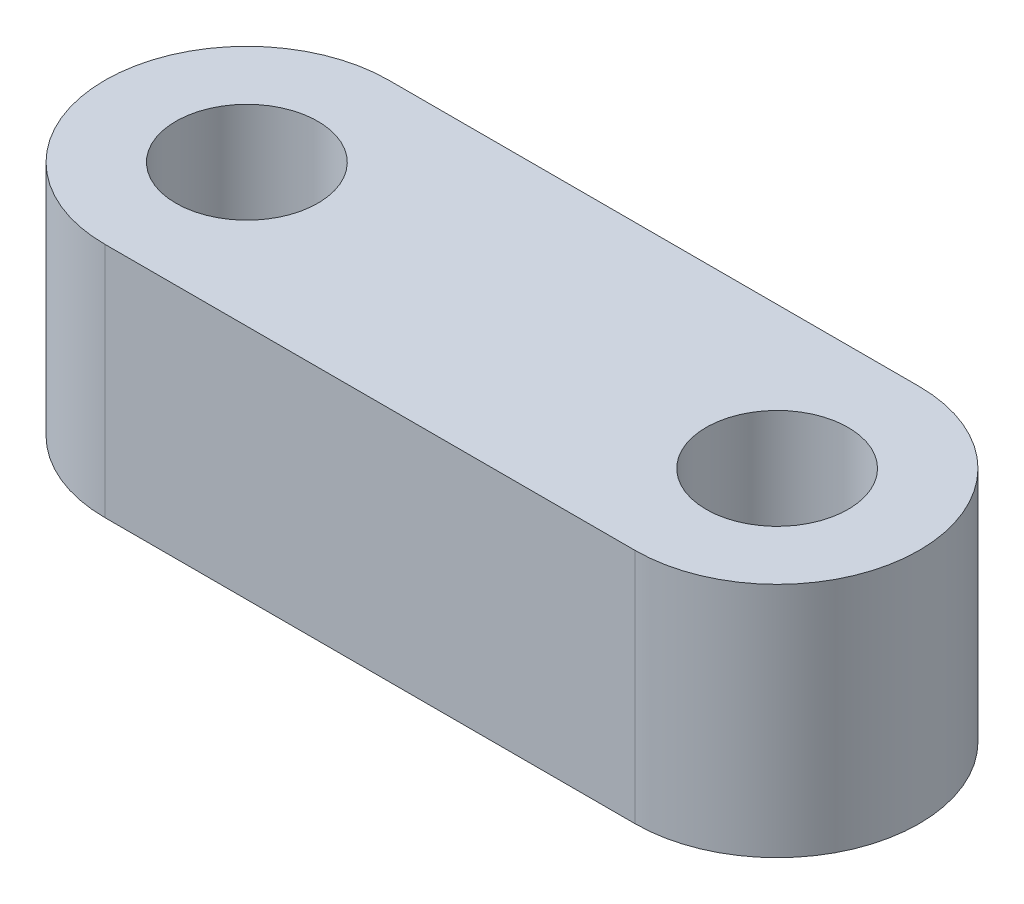
ISO-10303-21;
HEADER;
FILE_DESCRIPTION(('STEP AP214'),'2;1');
FILE_NAME('part.step','',(''),(''),'','','');
FILE_SCHEMA(('AUTOMOTIVE_DESIGN { 1 0 10303 214 1 1 1 1 }'));
ENDSEC;
DATA;
#1=APPLICATION_CONTEXT('core data for automotive mechanical design processes');
#2=APPLICATION_PROTOCOL_DEFINITION('international standard','automotive_design',2000,#1);
#3=PRODUCT_CONTEXT('',#1,'mechanical');
#4=PRODUCT('Part','Part','',(#3));
#5=PRODUCT_RELATED_PRODUCT_CATEGORY('part','',(#4));
#6=PRODUCT_DEFINITION_FORMATION('','',#4);
#7=PRODUCT_DEFINITION_CONTEXT('part definition',#1,'design');
#8=PRODUCT_DEFINITION('design','',#6,#7);
#9=PRODUCT_DEFINITION_SHAPE('','',#8);
#10=(LENGTH_UNIT() NAMED_UNIT(*) SI_UNIT(.MILLI.,.METRE.));
#11=(NAMED_UNIT(*) PLANE_ANGLE_UNIT() SI_UNIT($,.RADIAN.));
#12=(NAMED_UNIT(*) SI_UNIT($,.STERADIAN.) SOLID_ANGLE_UNIT());
#13=UNCERTAINTY_MEASURE_WITH_UNIT(LENGTH_MEASURE(1.E-05),#10,'distance_accuracy_value','');
#14=(GEOMETRIC_REPRESENTATION_CONTEXT(3) GLOBAL_UNCERTAINTY_ASSIGNED_CONTEXT((#13)) GLOBAL_UNIT_ASSIGNED_CONTEXT((#10,
#11,#12)) REPRESENTATION_CONTEXT('',''));
#15=CARTESIAN_POINT('',(0.,0.,0.));
#16=DIRECTION('',(0.,0.,1.));
#17=DIRECTION('',(1.,0.,0.));
#18=AXIS2_PLACEMENT_3D('',#15,#16,#17);
#19=CARTESIAN_POINT('',(0.,100.,0.));
#20=DIRECTION('',(0.,1.,0.));
#21=DIRECTION('',(0.,0.,1.));
#22=AXIS2_PLACEMENT_3D('',#19,#20,#21);
#23=PLANE('',#22);
#24=CARTESIAN_POINT('',(0.,100.,0.));
#25=DIRECTION('',(0.,1.,0.));
#26=DIRECTION('',(0.,0.,1.));
#27=AXIS2_PLACEMENT_3D('',#24,#25,#26);
#28=CIRCLE('',#27,30.);
#29=CARTESIAN_POINT('',(0.,100.,30.));
#30=VERTEX_POINT('',#29);
#31=EDGE_CURVE('E100',#30,#30,#28,.T.);
#32=ORIENTED_EDGE('',*,*,#31,.F.);
#33=EDGE_LOOP('',(#32));
#34=FACE_BOUND('',#33,.T.);
#35=CARTESIAN_POINT('',(0.,100.,0.));
#36=DIRECTION('',(0.,1.,0.));
#37=DIRECTION('',(0.,0.,1.));
#38=AXIS2_PLACEMENT_3D('',#35,#36,#37);
#39=CIRCLE('',#38,60.);
#40=CARTESIAN_POINT('',(0.,100.,-60.));
#41=VERTEX_POINT('',#40);
#42=CARTESIAN_POINT('',(0.,100.,60.));
#43=VERTEX_POINT('',#42);
#44=EDGE_CURVE('E85',#41,#43,#39,.T.);
#45=ORIENTED_EDGE('',*,*,#44,.T.);
#46=DIRECTION('',(1.,0.,0.));
#47=VECTOR('',#46,1.);
#48=CARTESIAN_POINT('',(0.,100.,60.));
#49=LINE('',#48,#47);
#50=CARTESIAN_POINT('',(224.,100.,60.));
#51=VERTEX_POINT('',#50);
#52=EDGE_CURVE('E80',#43,#51,#49,.T.);
#53=ORIENTED_EDGE('',*,*,#52,.T.);
#54=CARTESIAN_POINT('',(224.,100.,0.));
#55=DIRECTION('',(0.,1.,0.));
#56=DIRECTION('',(0.,0.,1.));
#57=AXIS2_PLACEMENT_3D('',#54,#55,#56);
#58=CIRCLE('',#57,60.);
#59=CARTESIAN_POINT('',(224.,100.,-60.));
#60=VERTEX_POINT('',#59);
#61=EDGE_CURVE('E83',#51,#60,#58,.T.);
#62=ORIENTED_EDGE('',*,*,#61,.T.);
#63=DIRECTION('',(-1.,0.,0.));
#64=VECTOR('',#63,1.);
#65=CARTESIAN_POINT('',(0.,100.,-60.));
#66=LINE('',#65,#64);
#67=EDGE_CURVE('E50',#60,#41,#66,.T.);
#68=ORIENTED_EDGE('',*,*,#67,.T.);
#69=EDGE_LOOP('',(#45,#53,#62,#68));
#70=FACE_BOUND('',#69,.T.);
#71=CARTESIAN_POINT('',(224.,100.,0.));
#72=DIRECTION('',(0.,1.,0.));
#73=DIRECTION('',(0.,0.,1.));
#74=AXIS2_PLACEMENT_3D('',#71,#72,#73);
#75=CIRCLE('',#74,30.);
#76=CARTESIAN_POINT('',(224.,100.,30.));
#77=VERTEX_POINT('',#76);
#78=EDGE_CURVE('E115',#77,#77,#75,.T.);
#79=ORIENTED_EDGE('',*,*,#78,.F.);
#80=EDGE_LOOP('',(#79));
#81=FACE_BOUND('',#80,.T.);
#82=ADVANCED_FACE('F33',(#34,#70,#81),#23,.T.);
#83=CARTESIAN_POINT('',(0.,0.,0.));
#84=DIRECTION('',(0.,1.,0.));
#85=DIRECTION('',(0.,0.,1.));
#86=AXIS2_PLACEMENT_3D('',#83,#84,#85);
#87=PLANE('',#86);
#88=CARTESIAN_POINT('',(0.,0.,0.));
#89=DIRECTION('',(0.,1.,0.));
#90=DIRECTION('',(0.,0.,1.));
#91=AXIS2_PLACEMENT_3D('',#88,#89,#90);
#92=CIRCLE('',#91,60.);
#93=CARTESIAN_POINT('',(0.,0.,-60.));
#94=VERTEX_POINT('',#93);
#95=CARTESIAN_POINT('',(0.,0.,60.));
#96=VERTEX_POINT('',#95);
#97=EDGE_CURVE('E97',#94,#96,#92,.T.);
#98=ORIENTED_EDGE('',*,*,#97,.F.);
#99=DIRECTION('',(-1.,0.,0.));
#100=VECTOR('',#99,1.);
#101=CARTESIAN_POINT('',(0.,0.,-60.));
#102=LINE('',#101,#100);
#103=CARTESIAN_POINT('',(224.,0.,-60.));
#104=VERTEX_POINT('',#103);
#105=EDGE_CURVE('E73',#104,#94,#102,.T.);
#106=ORIENTED_EDGE('',*,*,#105,.F.);
#107=CARTESIAN_POINT('',(224.,0.,0.));
#108=DIRECTION('',(0.,1.,0.));
#109=DIRECTION('',(0.,0.,1.));
#110=AXIS2_PLACEMENT_3D('',#107,#108,#109);
#111=CIRCLE('',#110,60.);
#112=CARTESIAN_POINT('',(224.,0.,60.));
#113=VERTEX_POINT('',#112);
#114=EDGE_CURVE('E67',#113,#104,#111,.T.);
#115=ORIENTED_EDGE('',*,*,#114,.F.);
#116=DIRECTION('',(1.,0.,0.));
#117=VECTOR('',#116,1.);
#118=CARTESIAN_POINT('',(0.,0.,60.));
#119=LINE('',#118,#117);
#120=EDGE_CURVE('E89',#96,#113,#119,.T.);
#121=ORIENTED_EDGE('',*,*,#120,.F.);
#122=EDGE_LOOP('',(#98,#106,#115,#121));
#123=FACE_BOUND('',#122,.T.);
#124=CARTESIAN_POINT('',(0.,0.,0.));
#125=DIRECTION('',(0.,1.,0.));
#126=DIRECTION('',(0.,0.,1.));
#127=AXIS2_PLACEMENT_3D('',#124,#125,#126);
#128=CIRCLE('',#127,30.);
#129=CARTESIAN_POINT('',(0.,0.,30.));
#130=VERTEX_POINT('',#129);
#131=EDGE_CURVE('E112',#130,#130,#128,.T.);
#132=ORIENTED_EDGE('',*,*,#131,.T.);
#133=EDGE_LOOP('',(#132));
#134=FACE_BOUND('',#133,.T.);
#135=CARTESIAN_POINT('',(224.,0.,0.));
#136=DIRECTION('',(0.,1.,0.));
#137=DIRECTION('',(0.,0.,1.));
#138=AXIS2_PLACEMENT_3D('',#135,#136,#137);
#139=CIRCLE('',#138,30.);
#140=CARTESIAN_POINT('',(224.,0.,30.));
#141=VERTEX_POINT('',#140);
#142=EDGE_CURVE('E118',#141,#141,#139,.T.);
#143=ORIENTED_EDGE('',*,*,#142,.T.);
#144=EDGE_LOOP('',(#143));
#145=FACE_BOUND('',#144,.T.);
#146=ADVANCED_FACE('F108',(#123,#134,#145),#87,.F.);
#147=CARTESIAN_POINT('',(0.,100.,0.));
#148=DIRECTION('',(0.,-1.,0.));
#149=DIRECTION('',(0.,0.,-1.));
#150=AXIS2_PLACEMENT_3D('',#147,#148,#149);
#151=CYLINDRICAL_SURFACE('',#150,60.);
#152=ORIENTED_EDGE('',*,*,#97,.T.);
#153=DIRECTION('',(0.,-1.,0.));
#154=VECTOR('',#153,1.);
#155=CARTESIAN_POINT('',(0.,100.,60.));
#156=LINE('',#155,#154);
#157=EDGE_CURVE('E11',#43,#96,#156,.T.);
#158=ORIENTED_EDGE('',*,*,#157,.F.);
#159=ORIENTED_EDGE('',*,*,#44,.F.);
#160=DIRECTION('',(0.,-1.,0.));
#161=VECTOR('',#160,1.);
#162=CARTESIAN_POINT('',(0.,100.,-60.));
#163=LINE('',#162,#161);
#164=EDGE_CURVE('E93',#41,#94,#163,.T.);
#165=ORIENTED_EDGE('',*,*,#164,.T.);
#166=EDGE_LOOP('',(#152,#158,#159,#165));
#167=FACE_BOUND('',#166,.T.);
#168=ADVANCED_FACE('F35',(#167),#151,.T.);
#169=CARTESIAN_POINT('',(0.,100.,60.));
#170=DIRECTION('',(0.,0.,-1.));
#171=DIRECTION('',(-1.,0.,0.));
#172=AXIS2_PLACEMENT_3D('',#169,#170,#171);
#173=PLANE('',#172);
#174=ORIENTED_EDGE('',*,*,#120,.T.);
#175=DIRECTION('',(0.,-1.,0.));
#176=VECTOR('',#175,1.);
#177=CARTESIAN_POINT('',(224.,100.,60.));
#178=LINE('',#177,#176);
#179=EDGE_CURVE('E42',#51,#113,#178,.T.);
#180=ORIENTED_EDGE('',*,*,#179,.F.);
#181=ORIENTED_EDGE('',*,*,#52,.F.);
#182=ORIENTED_EDGE('',*,*,#157,.T.);
#183=EDGE_LOOP('',(#174,#180,#181,#182));
#184=FACE_BOUND('',#183,.T.);
#185=ADVANCED_FACE('F88',(#184),#173,.F.);
#186=CARTESIAN_POINT('',(224.,100.,0.));
#187=DIRECTION('',(0.,-1.,0.));
#188=DIRECTION('',(0.,0.,-1.));
#189=AXIS2_PLACEMENT_3D('',#186,#187,#188);
#190=CYLINDRICAL_SURFACE('',#189,60.);
#191=ORIENTED_EDGE('',*,*,#114,.T.);
#192=DIRECTION('',(0.,-1.,0.));
#193=VECTOR('',#192,1.);
#194=CARTESIAN_POINT('',(224.,100.,-60.));
#195=LINE('',#194,#193);
#196=EDGE_CURVE('E90',#60,#104,#195,.T.);
#197=ORIENTED_EDGE('',*,*,#196,.F.);
#198=ORIENTED_EDGE('',*,*,#61,.F.);
#199=ORIENTED_EDGE('',*,*,#179,.T.);
#200=EDGE_LOOP('',(#191,#197,#198,#199));
#201=FACE_BOUND('',#200,.T.);
#202=ADVANCED_FACE('F91',(#201),#190,.T.);
#203=CARTESIAN_POINT('',(0.,100.,-60.));
#204=DIRECTION('',(0.,0.,1.));
#205=DIRECTION('',(1.,0.,0.));
#206=AXIS2_PLACEMENT_3D('',#203,#204,#205);
#207=PLANE('',#206);
#208=ORIENTED_EDGE('',*,*,#105,.T.);
#209=ORIENTED_EDGE('',*,*,#164,.F.);
#210=ORIENTED_EDGE('',*,*,#67,.F.);
#211=ORIENTED_EDGE('',*,*,#196,.T.);
#212=EDGE_LOOP('',(#208,#209,#210,#211));
#213=FACE_BOUND('',#212,.T.);
#214=ADVANCED_FACE('F105',(#213),#207,.F.);
#215=CARTESIAN_POINT('',(0.,100.,0.));
#216=DIRECTION('',(0.,-1.,0.));
#217=DIRECTION('',(0.,0.,-1.));
#218=AXIS2_PLACEMENT_3D('',#215,#216,#217);
#219=CYLINDRICAL_SURFACE('',#218,30.);
#220=ORIENTED_EDGE('',*,*,#31,.T.);
#221=EDGE_LOOP('',(#220));
#222=FACE_BOUND('',#221,.T.);
#223=ORIENTED_EDGE('',*,*,#131,.F.);
#224=EDGE_LOOP('',(#223));
#225=FACE_BOUND('',#224,.T.);
#226=ADVANCED_FACE('F135',(#222,#225),#219,.F.);
#227=CARTESIAN_POINT('',(224.,100.,0.));
#228=DIRECTION('',(0.,-1.,0.));
#229=DIRECTION('',(0.,0.,-1.));
#230=AXIS2_PLACEMENT_3D('',#227,#228,#229);
#231=CYLINDRICAL_SURFACE('',#230,30.);
#232=ORIENTED_EDGE('',*,*,#78,.T.);
#233=EDGE_LOOP('',(#232));
#234=FACE_BOUND('',#233,.T.);
#235=ORIENTED_EDGE('',*,*,#142,.F.);
#236=EDGE_LOOP('',(#235));
#237=FACE_BOUND('',#236,.T.);
#238=ADVANCED_FACE('F124',(#234,#237),#231,.F.);
#239=CLOSED_SHELL('',(#82,#146,#168,#185,#202,#214,#226,#238));
#240=MANIFOLD_SOLID_BREP('B2',#239);
#241=ADVANCED_BREP_SHAPE_REPRESENTATION('',(#18,#240),#14);
#242=SHAPE_DEFINITION_REPRESENTATION(#9,#241);
ENDSEC;
END-ISO-10303-21;
